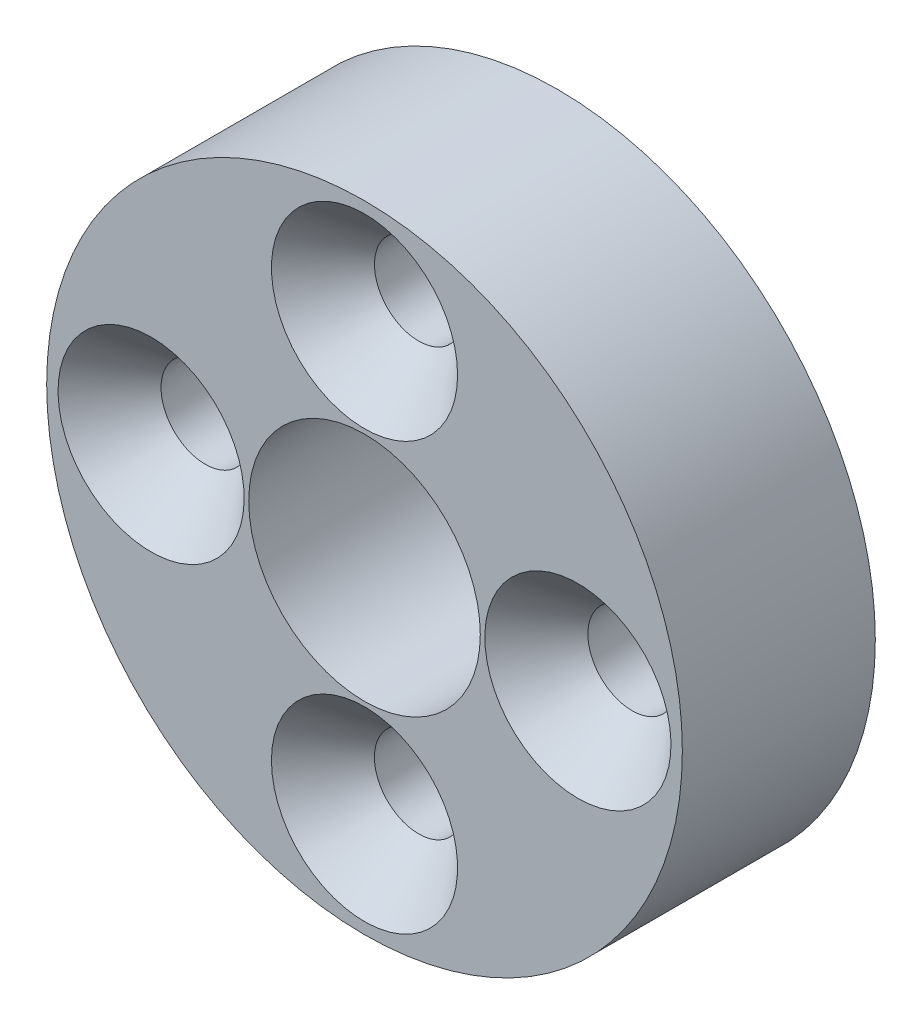
ISO-10303-21;
HEADER;
FILE_DESCRIPTION(('STEP AP214'),'2;1');
FILE_NAME('part.step','',(''),(''),'','','');
FILE_SCHEMA(('AUTOMOTIVE_DESIGN { 1 0 10303 214 1 1 1 1 }'));
ENDSEC;
DATA;
#1=APPLICATION_CONTEXT('core data for automotive mechanical design processes');
#2=APPLICATION_PROTOCOL_DEFINITION('international standard','automotive_design',2000,#1);
#3=PRODUCT_CONTEXT('',#1,'mechanical');
#4=PRODUCT('Part','Part','',(#3));
#5=PRODUCT_RELATED_PRODUCT_CATEGORY('part','',(#4));
#6=PRODUCT_DEFINITION_FORMATION('','',#4);
#7=PRODUCT_DEFINITION_CONTEXT('part definition',#1,'design');
#8=PRODUCT_DEFINITION('design','',#6,#7);
#9=PRODUCT_DEFINITION_SHAPE('','',#8);
#10=(LENGTH_UNIT() NAMED_UNIT(*) SI_UNIT(.MILLI.,.METRE.));
#11=(NAMED_UNIT(*) PLANE_ANGLE_UNIT() SI_UNIT($,.RADIAN.));
#12=(NAMED_UNIT(*) SI_UNIT($,.STERADIAN.) SOLID_ANGLE_UNIT());
#13=UNCERTAINTY_MEASURE_WITH_UNIT(LENGTH_MEASURE(1.E-05),#10,'distance_accuracy_value','');
#14=(GEOMETRIC_REPRESENTATION_CONTEXT(3) GLOBAL_UNCERTAINTY_ASSIGNED_CONTEXT((#13)) GLOBAL_UNIT_ASSIGNED_CONTEXT((#10,
#11,#12)) REPRESENTATION_CONTEXT('',''));
#15=CARTESIAN_POINT('',(0.,0.,0.));
#16=DIRECTION('',(0.,0.,1.));
#17=DIRECTION('',(1.,0.,0.));
#18=AXIS2_PLACEMENT_3D('',#15,#16,#17);
#19=CARTESIAN_POINT('',(11.938,0.,10.795));
#20=DIRECTION('',(0.,0.,-1.));
#21=DIRECTION('',(-1.,0.,0.));
#22=AXIS2_PLACEMENT_3D('',#19,#20,#21);
#23=CYLINDRICAL_SURFACE('',#22,2.47649999999999);
#24=CARTESIAN_POINT('',(11.938,0.,0.));
#25=DIRECTION('',(0.,0.,1.));
#26=DIRECTION('',(1.,0.,0.));
#27=AXIS2_PLACEMENT_3D('',#24,#25,#26);
#28=CIRCLE('',#27,2.47649999999999);
#29=CARTESIAN_POINT('',(14.4145,0.,0.));
#30=VERTEX_POINT('',#29);
#31=EDGE_CURVE('E112',#30,#30,#28,.T.);
#32=ORIENTED_EDGE('',*,*,#31,.F.);
#33=EDGE_LOOP('',(#32));
#34=FACE_BOUND('',#33,.T.);
#35=CARTESIAN_POINT('',(11.938,1.25043912669328E-13,7.76247252825889));
#36=DIRECTION('',(0.,0.,1.));
#37=DIRECTION('',(1.,0.,0.));
#38=AXIS2_PLACEMENT_3D('',#35,#36,#37);
#39=CIRCLE('',#38,2.47649999999999);
#40=CARTESIAN_POINT('',(14.4145,1.25043912669328E-13,7.76247252825889));
#41=VERTEX_POINT('',#40);
#42=EDGE_CURVE('E40',#41,#41,#39,.T.);
#43=ORIENTED_EDGE('',*,*,#42,.T.);
#44=EDGE_LOOP('',(#43));
#45=FACE_BOUND('',#44,.T.);
#46=ADVANCED_FACE('F36',(#34,#45),#23,.F.);
#47=CARTESIAN_POINT('',(0.,-11.938,10.795));
#48=DIRECTION('',(0.,0.,-1.));
#49=DIRECTION('',(-1.,0.,0.));
#50=AXIS2_PLACEMENT_3D('',#47,#48,#49);
#51=CYLINDRICAL_SURFACE('',#50,2.4765);
#52=CARTESIAN_POINT('',(0.,-11.938,0.));
#53=DIRECTION('',(0.,0.,1.));
#54=DIRECTION('',(1.,0.,0.));
#55=AXIS2_PLACEMENT_3D('',#52,#53,#54);
#56=CIRCLE('',#55,2.4765);
#57=CARTESIAN_POINT('',(2.4765,-11.938,0.));
#58=VERTEX_POINT('',#57);
#59=EDGE_CURVE('E101',#58,#58,#56,.T.);
#60=ORIENTED_EDGE('',*,*,#59,.F.);
#61=EDGE_LOOP('',(#60));
#62=FACE_BOUND('',#61,.T.);
#63=CARTESIAN_POINT('',(0.,-11.938,7.7624725282589));
#64=DIRECTION('',(0.,0.,1.));
#65=DIRECTION('',(1.,0.,0.));
#66=AXIS2_PLACEMENT_3D('',#63,#64,#65);
#67=CIRCLE('',#66,2.4765);
#68=CARTESIAN_POINT('',(2.4765,-11.938,7.7624725282589));
#69=VERTEX_POINT('',#68);
#70=EDGE_CURVE('E131',#69,#69,#67,.T.);
#71=ORIENTED_EDGE('',*,*,#70,.T.);
#72=EDGE_LOOP('',(#71));
#73=FACE_BOUND('',#72,.T.);
#74=ADVANCED_FACE('F174',(#62,#73),#51,.F.);
#75=CARTESIAN_POINT('',(-11.938,0.,10.795));
#76=DIRECTION('',(0.,0.,-1.));
#77=DIRECTION('',(-1.,0.,0.));
#78=AXIS2_PLACEMENT_3D('',#75,#76,#77);
#79=CYLINDRICAL_SURFACE('',#78,2.47649999999999);
#80=CARTESIAN_POINT('',(-11.938,0.,0.));
#81=DIRECTION('',(0.,0.,1.));
#82=DIRECTION('',(1.,0.,0.));
#83=AXIS2_PLACEMENT_3D('',#80,#81,#82);
#84=CIRCLE('',#83,2.47649999999999);
#85=CARTESIAN_POINT('',(-9.4615,0.,0.));
#86=VERTEX_POINT('',#85);
#87=EDGE_CURVE('E115',#86,#86,#84,.T.);
#88=ORIENTED_EDGE('',*,*,#87,.F.);
#89=EDGE_LOOP('',(#88));
#90=FACE_BOUND('',#89,.T.);
#91=CARTESIAN_POINT('',(-11.938,0.,7.76247252825889));
#92=DIRECTION('',(0.,0.,1.));
#93=DIRECTION('',(1.,0.,0.));
#94=AXIS2_PLACEMENT_3D('',#91,#92,#93);
#95=CIRCLE('',#94,2.47649999999999);
#96=CARTESIAN_POINT('',(-9.4615,0.,7.76247252825889));
#97=VERTEX_POINT('',#96);
#98=EDGE_CURVE('E128',#97,#97,#95,.T.);
#99=ORIENTED_EDGE('',*,*,#98,.T.);
#100=EDGE_LOOP('',(#99));
#101=FACE_BOUND('',#100,.T.);
#102=ADVANCED_FACE('F180',(#90,#101),#79,.F.);
#103=CARTESIAN_POINT('',(0.,11.938,10.795));
#104=DIRECTION('',(0.,0.,-1.));
#105=DIRECTION('',(-1.,0.,0.));
#106=AXIS2_PLACEMENT_3D('',#103,#104,#105);
#107=CYLINDRICAL_SURFACE('',#106,2.4765);
#108=CARTESIAN_POINT('',(0.,11.938,0.));
#109=DIRECTION('',(0.,0.,1.));
#110=DIRECTION('',(1.,0.,0.));
#111=AXIS2_PLACEMENT_3D('',#108,#109,#110);
#112=CIRCLE('',#111,2.4765);
#113=CARTESIAN_POINT('',(2.4765,11.938,0.));
#114=VERTEX_POINT('',#113);
#115=EDGE_CURVE('E104',#114,#114,#112,.T.);
#116=ORIENTED_EDGE('',*,*,#115,.F.);
#117=EDGE_LOOP('',(#116));
#118=FACE_BOUND('',#117,.T.);
#119=CARTESIAN_POINT('',(0.,11.938,7.7624725282589));
#120=DIRECTION('',(0.,0.,1.));
#121=DIRECTION('',(1.,0.,0.));
#122=AXIS2_PLACEMENT_3D('',#119,#120,#121);
#123=CIRCLE('',#122,2.4765);
#124=CARTESIAN_POINT('',(2.4765,11.938,7.7624725282589));
#125=VERTEX_POINT('',#124);
#126=EDGE_CURVE('E123',#125,#125,#123,.T.);
#127=ORIENTED_EDGE('',*,*,#126,.T.);
#128=EDGE_LOOP('',(#127));
#129=FACE_BOUND('',#128,.T.);
#130=ADVANCED_FACE('F187',(#118,#129),#107,.F.);
#131=CARTESIAN_POINT('',(0.,0.,0.));
#132=DIRECTION('',(0.,0.,1.));
#133=DIRECTION('',(1.,0.,0.));
#134=AXIS2_PLACEMENT_3D('',#131,#132,#133);
#135=PLANE('',#134);
#136=ORIENTED_EDGE('',*,*,#59,.T.);
#137=EDGE_LOOP('',(#136));
#138=FACE_BOUND('',#137,.T.);
#139=ORIENTED_EDGE('',*,*,#115,.T.);
#140=EDGE_LOOP('',(#139));
#141=FACE_BOUND('',#140,.T.);
#142=ORIENTED_EDGE('',*,*,#31,.T.);
#143=EDGE_LOOP('',(#142));
#144=FACE_BOUND('',#143,.T.);
#145=ORIENTED_EDGE('',*,*,#87,.T.);
#146=EDGE_LOOP('',(#145));
#147=FACE_BOUND('',#146,.T.);
#148=CARTESIAN_POINT('',(0.,0.,0.));
#149=DIRECTION('',(0.,0.,1.));
#150=DIRECTION('',(1.,0.,0.));
#151=AXIS2_PLACEMENT_3D('',#148,#149,#150);
#152=CIRCLE('',#151,17.78);
#153=CARTESIAN_POINT('',(17.78,0.,0.));
#154=VERTEX_POINT('',#153);
#155=EDGE_CURVE('E45',#154,#154,#152,.T.);
#156=ORIENTED_EDGE('',*,*,#155,.F.);
#157=EDGE_LOOP('',(#156));
#158=FACE_BOUND('',#157,.T.);
#159=DIRECTION('',(0.,1.,0.));
#160=VECTOR('',#159,1.);
#161=CARTESIAN_POINT('',(-8.255,-8.255,0.));
#162=LINE('',#161,#160);
#163=CARTESIAN_POINT('',(-8.255,-8.255,0.));
#164=VERTEX_POINT('',#163);
#165=CARTESIAN_POINT('',(-8.255,8.255,0.));
#166=VERTEX_POINT('',#165);
#167=EDGE_CURVE('E100',#164,#166,#162,.T.);
#168=ORIENTED_EDGE('',*,*,#167,.F.);
#169=DIRECTION('',(-1.,0.,0.));
#170=VECTOR('',#169,1.);
#171=CARTESIAN_POINT('',(8.255,-8.255,0.));
#172=LINE('',#171,#170);
#173=CARTESIAN_POINT('',(8.255,-8.255,0.));
#174=VERTEX_POINT('',#173);
#175=EDGE_CURVE('E97',#174,#164,#172,.T.);
#176=ORIENTED_EDGE('',*,*,#175,.F.);
#177=DIRECTION('',(0.,-1.,0.));
#178=VECTOR('',#177,1.);
#179=CARTESIAN_POINT('',(8.255,-8.255,0.));
#180=LINE('',#179,#178);
#181=CARTESIAN_POINT('',(8.255,8.255,0.));
#182=VERTEX_POINT('',#181);
#183=EDGE_CURVE('E58',#182,#174,#180,.T.);
#184=ORIENTED_EDGE('',*,*,#183,.F.);
#185=DIRECTION('',(1.,0.,0.));
#186=VECTOR('',#185,1.);
#187=CARTESIAN_POINT('',(8.255,8.255,0.));
#188=LINE('',#187,#186);
#189=EDGE_CURVE('E53',#166,#182,#188,.T.);
#190=ORIENTED_EDGE('',*,*,#189,.F.);
#191=EDGE_LOOP('',(#168,#176,#184,#190));
#192=FACE_BOUND('',#191,.T.);
#193=ADVANCED_FACE('F197',(#138,#141,#144,#147,#158,#192),#135,.F.);
#194=CARTESIAN_POINT('',(0.,0.,10.795));
#195=DIRECTION('',(0.,0.,1.));
#196=DIRECTION('',(1.,0.,0.));
#197=AXIS2_PLACEMENT_3D('',#194,#195,#196);
#198=PLANE('',#197);
#199=CARTESIAN_POINT('',(11.938,1.25043912669328E-13,10.795));
#200=DIRECTION('',(0.,0.,1.));
#201=DIRECTION('',(0.,-1.,0.));
#202=AXIS2_PLACEMENT_3D('',#199,#200,#201);
#203=CIRCLE('',#202,5.207);
#204=CARTESIAN_POINT('',(11.9380000000001,-5.20699999999988,10.795));
#205=VERTEX_POINT('',#204);
#206=EDGE_CURVE('E143',#205,#205,#203,.T.);
#207=ORIENTED_EDGE('',*,*,#206,.F.);
#208=EDGE_LOOP('',(#207));
#209=FACE_BOUND('',#208,.T.);
#210=CARTESIAN_POINT('',(0.,-11.938,10.795));
#211=DIRECTION('',(0.,0.,1.));
#212=DIRECTION('',(-1.,0.,0.));
#213=AXIS2_PLACEMENT_3D('',#210,#211,#212);
#214=CIRCLE('',#213,5.207);
#215=CARTESIAN_POINT('',(-5.207,-11.938,10.795));
#216=VERTEX_POINT('',#215);
#217=EDGE_CURVE('E133',#216,#216,#214,.T.);
#218=ORIENTED_EDGE('',*,*,#217,.F.);
#219=EDGE_LOOP('',(#218));
#220=FACE_BOUND('',#219,.T.);
#221=CARTESIAN_POINT('',(-11.938,0.,10.795));
#222=DIRECTION('',(0.,0.,1.));
#223=DIRECTION('',(0.,1.,0.));
#224=AXIS2_PLACEMENT_3D('',#221,#222,#223);
#225=CIRCLE('',#224,5.207);
#226=CARTESIAN_POINT('',(-11.938,5.20699999999996,10.795));
#227=VERTEX_POINT('',#226);
#228=EDGE_CURVE('E130',#227,#227,#225,.T.);
#229=ORIENTED_EDGE('',*,*,#228,.F.);
#230=EDGE_LOOP('',(#229));
#231=FACE_BOUND('',#230,.T.);
#232=CARTESIAN_POINT('',(0.,11.938,10.795));
#233=DIRECTION('',(0.,0.,1.));
#234=DIRECTION('',(1.,0.,0.));
#235=AXIS2_PLACEMENT_3D('',#232,#233,#234);
#236=CIRCLE('',#235,5.207);
#237=CARTESIAN_POINT('',(5.207,11.938,10.795));
#238=VERTEX_POINT('',#237);
#239=EDGE_CURVE('E127',#238,#238,#236,.T.);
#240=ORIENTED_EDGE('',*,*,#239,.F.);
#241=EDGE_LOOP('',(#240));
#242=FACE_BOUND('',#241,.T.);
#243=CARTESIAN_POINT('',(0.,0.,10.795));
#244=DIRECTION('',(0.,0.,1.));
#245=DIRECTION('',(1.,0.,0.));
#246=AXIS2_PLACEMENT_3D('',#243,#244,#245);
#247=CIRCLE('',#246,17.78);
#248=CARTESIAN_POINT('',(17.78,0.,10.795));
#249=VERTEX_POINT('',#248);
#250=EDGE_CURVE('E11',#249,#249,#247,.T.);
#251=ORIENTED_EDGE('',*,*,#250,.T.);
#252=EDGE_LOOP('',(#251));
#253=FACE_BOUND('',#252,.T.);
#254=CARTESIAN_POINT('',(0.,0.,10.795));
#255=DIRECTION('',(0.,0.,1.));
#256=DIRECTION('',(1.,0.,0.));
#257=AXIS2_PLACEMENT_3D('',#254,#255,#256);
#258=CIRCLE('',#257,6.477);
#259=CARTESIAN_POINT('',(6.477,0.,10.795));
#260=VERTEX_POINT('',#259);
#261=EDGE_CURVE('E118',#260,#260,#258,.T.);
#262=ORIENTED_EDGE('',*,*,#261,.F.);
#263=EDGE_LOOP('',(#262));
#264=FACE_BOUND('',#263,.T.);
#265=ADVANCED_FACE('F195',(#209,#220,#231,#242,#253,#264),#198,.T.);
#266=CARTESIAN_POINT('',(0.,0.,10.795));
#267=DIRECTION('',(0.,0.,-1.));
#268=DIRECTION('',(-1.,0.,0.));
#269=AXIS2_PLACEMENT_3D('',#266,#267,#268);
#270=CYLINDRICAL_SURFACE('',#269,17.78);
#271=ORIENTED_EDGE('',*,*,#250,.F.);
#272=EDGE_LOOP('',(#271));
#273=FACE_BOUND('',#272,.T.);
#274=ORIENTED_EDGE('',*,*,#155,.T.);
#275=EDGE_LOOP('',(#274));
#276=FACE_BOUND('',#275,.T.);
#277=ADVANCED_FACE('F38',(#273,#276),#270,.T.);
#278=CARTESIAN_POINT('',(0.,0.,10.795));
#279=DIRECTION('',(0.,0.,-1.));
#280=DIRECTION('',(-1.,0.,0.));
#281=AXIS2_PLACEMENT_3D('',#278,#279,#280);
#282=CYLINDRICAL_SURFACE('',#281,6.477);
#283=ORIENTED_EDGE('',*,*,#261,.T.);
#284=EDGE_LOOP('',(#283));
#285=FACE_BOUND('',#284,.T.);
#286=CARTESIAN_POINT('',(0.,0.,-3.175));
#287=DIRECTION('',(0.,0.,-1.));
#288=DIRECTION('',(-1.,0.,0.));
#289=AXIS2_PLACEMENT_3D('',#286,#287,#288);
#290=CIRCLE('',#289,6.477);
#291=CARTESIAN_POINT('',(-6.477,0.,-3.175));
#292=VERTEX_POINT('',#291);
#293=EDGE_CURVE('E126',#292,#292,#290,.T.);
#294=ORIENTED_EDGE('',*,*,#293,.T.);
#295=EDGE_LOOP('',(#294));
#296=FACE_BOUND('',#295,.T.);
#297=ADVANCED_FACE('F191',(#285,#296),#282,.F.);
#298=CARTESIAN_POINT('',(0.,0.,-3.175));
#299=DIRECTION('',(0.,0.,1.));
#300=DIRECTION('',(1.,0.,0.));
#301=AXIS2_PLACEMENT_3D('',#298,#299,#300);
#302=PLANE('',#301);
#303=DIRECTION('',(0.,1.,0.));
#304=VECTOR('',#303,1.);
#305=CARTESIAN_POINT('',(-8.255,-8.255,-3.175));
#306=LINE('',#305,#304);
#307=CARTESIAN_POINT('',(-8.255,-8.255,-3.175));
#308=VERTEX_POINT('',#307);
#309=CARTESIAN_POINT('',(-8.255,8.255,-3.175));
#310=VERTEX_POINT('',#309);
#311=EDGE_CURVE('E87',#308,#310,#306,.T.);
#312=ORIENTED_EDGE('',*,*,#311,.T.);
#313=DIRECTION('',(1.,0.,0.));
#314=VECTOR('',#313,1.);
#315=CARTESIAN_POINT('',(8.255,8.255,-3.175));
#316=LINE('',#315,#314);
#317=CARTESIAN_POINT('',(8.255,8.255,-3.175));
#318=VERTEX_POINT('',#317);
#319=EDGE_CURVE('E76',#310,#318,#316,.T.);
#320=ORIENTED_EDGE('',*,*,#319,.T.);
#321=DIRECTION('',(0.,-1.,0.));
#322=VECTOR('',#321,1.);
#323=CARTESIAN_POINT('',(8.255,-8.255,-3.175));
#324=LINE('',#323,#322);
#325=CARTESIAN_POINT('',(8.255,-8.255,-3.175));
#326=VERTEX_POINT('',#325);
#327=EDGE_CURVE('E86',#318,#326,#324,.T.);
#328=ORIENTED_EDGE('',*,*,#327,.T.);
#329=DIRECTION('',(-1.,0.,0.));
#330=VECTOR('',#329,1.);
#331=CARTESIAN_POINT('',(8.255,-8.255,-3.175));
#332=LINE('',#331,#330);
#333=EDGE_CURVE('E93',#326,#308,#332,.T.);
#334=ORIENTED_EDGE('',*,*,#333,.T.);
#335=EDGE_LOOP('',(#312,#320,#328,#334));
#336=FACE_BOUND('',#335,.T.);
#337=ORIENTED_EDGE('',*,*,#293,.F.);
#338=EDGE_LOOP('',(#337));
#339=FACE_BOUND('',#338,.T.);
#340=ADVANCED_FACE('F90',(#336,#339),#302,.F.);
#341=CARTESIAN_POINT('',(-8.255,-8.255,-3.175));
#342=DIRECTION('',(1.,0.,0.));
#343=DIRECTION('',(0.,0.,-1.));
#344=AXIS2_PLACEMENT_3D('',#341,#342,#343);
#345=PLANE('',#344);
#346=ORIENTED_EDGE('',*,*,#167,.T.);
#347=DIRECTION('',(0.,0.,1.));
#348=VECTOR('',#347,1.);
#349=CARTESIAN_POINT('',(-8.255,8.255,-3.175));
#350=LINE('',#349,#348);
#351=EDGE_CURVE('E80',#310,#166,#350,.T.);
#352=ORIENTED_EDGE('',*,*,#351,.F.);
#353=ORIENTED_EDGE('',*,*,#311,.F.);
#354=DIRECTION('',(0.,0.,1.));
#355=VECTOR('',#354,1.);
#356=CARTESIAN_POINT('',(-8.255,-8.255,-3.175));
#357=LINE('',#356,#355);
#358=EDGE_CURVE('E152',#308,#164,#357,.T.);
#359=ORIENTED_EDGE('',*,*,#358,.T.);
#360=EDGE_LOOP('',(#346,#352,#353,#359));
#361=FACE_BOUND('',#360,.T.);
#362=ADVANCED_FACE('F99',(#361),#345,.F.);
#363=CARTESIAN_POINT('',(8.255,8.255,-3.175));
#364=DIRECTION('',(0.,-1.,0.));
#365=DIRECTION('',(0.,0.,-1.));
#366=AXIS2_PLACEMENT_3D('',#363,#364,#365);
#367=PLANE('',#366);
#368=ORIENTED_EDGE('',*,*,#189,.T.);
#369=DIRECTION('',(0.,0.,1.));
#370=VECTOR('',#369,1.);
#371=CARTESIAN_POINT('',(8.255,8.255,-3.175));
#372=LINE('',#371,#370);
#373=EDGE_CURVE('E83',#318,#182,#372,.T.);
#374=ORIENTED_EDGE('',*,*,#373,.F.);
#375=ORIENTED_EDGE('',*,*,#319,.F.);
#376=ORIENTED_EDGE('',*,*,#351,.T.);
#377=EDGE_LOOP('',(#368,#374,#375,#376));
#378=FACE_BOUND('',#377,.T.);
#379=ADVANCED_FACE('F78',(#378),#367,.F.);
#380=CARTESIAN_POINT('',(8.255,-8.255,-3.175));
#381=DIRECTION('',(-1.,0.,0.));
#382=DIRECTION('',(0.,0.,1.));
#383=AXIS2_PLACEMENT_3D('',#380,#381,#382);
#384=PLANE('',#383);
#385=ORIENTED_EDGE('',*,*,#183,.T.);
#386=DIRECTION('',(0.,0.,1.));
#387=VECTOR('',#386,1.);
#388=CARTESIAN_POINT('',(8.255,-8.255,-3.175));
#389=LINE('',#388,#387);
#390=EDGE_CURVE('E106',#326,#174,#389,.T.);
#391=ORIENTED_EDGE('',*,*,#390,.F.);
#392=ORIENTED_EDGE('',*,*,#327,.F.);
#393=ORIENTED_EDGE('',*,*,#373,.T.);
#394=EDGE_LOOP('',(#385,#391,#392,#393));
#395=FACE_BOUND('',#394,.T.);
#396=ADVANCED_FACE('F163',(#395),#384,.F.);
#397=CARTESIAN_POINT('',(8.255,-8.255,-3.175));
#398=DIRECTION('',(0.,1.,0.));
#399=DIRECTION('',(0.,0.,1.));
#400=AXIS2_PLACEMENT_3D('',#397,#398,#399);
#401=PLANE('',#400);
#402=ORIENTED_EDGE('',*,*,#175,.T.);
#403=ORIENTED_EDGE('',*,*,#358,.F.);
#404=ORIENTED_EDGE('',*,*,#333,.F.);
#405=ORIENTED_EDGE('',*,*,#390,.T.);
#406=EDGE_LOOP('',(#402,#403,#404,#405));
#407=FACE_BOUND('',#406,.T.);
#408=ADVANCED_FACE('F161',(#407),#401,.F.);
#409=CARTESIAN_POINT('',(0.,11.938,7.493));
#410=DIRECTION('',(0.,0.,1.));
#411=DIRECTION('',(1.,0.,0.));
#412=AXIS2_PLACEMENT_3D('',#409,#410,#411);
#413=CONICAL_SURFACE('',#412,2.23386584572853,0.73303828583762);
#414=ORIENTED_EDGE('',*,*,#126,.F.);
#415=EDGE_LOOP('',(#414));
#416=FACE_BOUND('',#415,.T.);
#417=ORIENTED_EDGE('',*,*,#239,.T.);
#418=EDGE_LOOP('',(#417));
#419=FACE_BOUND('',#418,.T.);
#420=ADVANCED_FACE('F170',(#416,#419),#413,.F.);
#421=CARTESIAN_POINT('',(-11.938,0.,7.493));
#422=DIRECTION('',(0.,0.,1.));
#423=DIRECTION('',(0.,1.,0.));
#424=AXIS2_PLACEMENT_3D('',#421,#422,#423);
#425=CONICAL_SURFACE('',#424,2.23386584572853,0.73303828583762);
#426=ORIENTED_EDGE('',*,*,#98,.F.);
#427=EDGE_LOOP('',(#426));
#428=FACE_BOUND('',#427,.T.);
#429=ORIENTED_EDGE('',*,*,#228,.T.);
#430=EDGE_LOOP('',(#429));
#431=FACE_BOUND('',#430,.T.);
#432=ADVANCED_FACE('F233',(#428,#431),#425,.F.);
#433=CARTESIAN_POINT('',(0.,-11.938,7.493));
#434=DIRECTION('',(0.,0.,1.));
#435=DIRECTION('',(-1.,0.,0.));
#436=AXIS2_PLACEMENT_3D('',#433,#434,#435);
#437=CONICAL_SURFACE('',#436,2.23386584572853,0.73303828583762);
#438=ORIENTED_EDGE('',*,*,#70,.F.);
#439=EDGE_LOOP('',(#438));
#440=FACE_BOUND('',#439,.T.);
#441=ORIENTED_EDGE('',*,*,#217,.T.);
#442=EDGE_LOOP('',(#441));
#443=FACE_BOUND('',#442,.T.);
#444=ADVANCED_FACE('F237',(#440,#443),#437,.F.);
#445=CARTESIAN_POINT('',(11.938,1.25043912669328E-13,7.493));
#446=DIRECTION('',(0.,0.,1.));
#447=DIRECTION('',(0.,-1.,0.));
#448=AXIS2_PLACEMENT_3D('',#445,#446,#447);
#449=CONICAL_SURFACE('',#448,2.23386584572853,0.73303828583762);
#450=ORIENTED_EDGE('',*,*,#42,.F.);
#451=EDGE_LOOP('',(#450));
#452=FACE_BOUND('',#451,.T.);
#453=ORIENTED_EDGE('',*,*,#206,.T.);
#454=EDGE_LOOP('',(#453));
#455=FACE_BOUND('',#454,.T.);
#456=ADVANCED_FACE('F241',(#452,#455),#449,.F.);
#457=CLOSED_SHELL('',(#46,#74,#102,#130,#193,#265,#277,#297,#340,#362,#379,#396,#408,#420,#432,
#444,#456));
#458=MANIFOLD_SOLID_BREP('B2',#457);
#459=ADVANCED_BREP_SHAPE_REPRESENTATION('',(#18,#458),#14);
#460=SHAPE_DEFINITION_REPRESENTATION(#9,#459);
ENDSEC;
END-ISO-10303-21;
